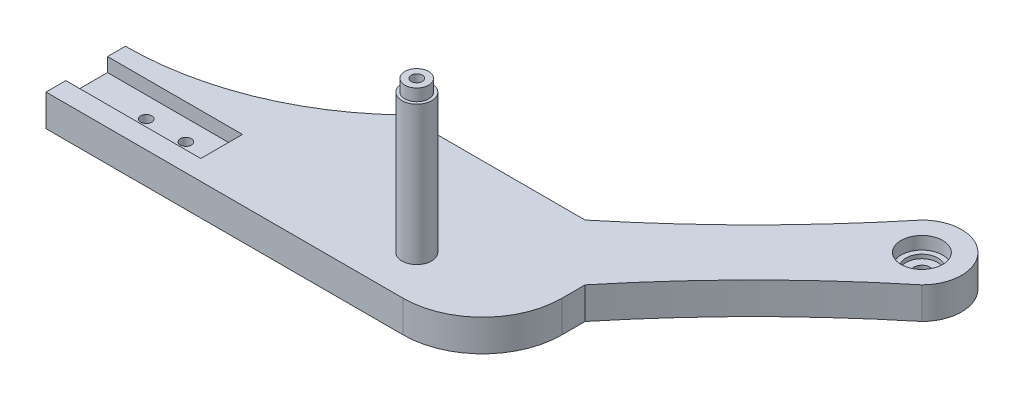
ISO-10303-21;
HEADER;
FILE_DESCRIPTION(('STEP AP214'),'2;1');
FILE_NAME('part.step','',(''),(''),'','','');
FILE_SCHEMA(('AUTOMOTIVE_DESIGN { 1 0 10303 214 1 1 1 1 }'));
ENDSEC;
DATA;
#1=APPLICATION_CONTEXT('core data for automotive mechanical design processes');
#2=APPLICATION_PROTOCOL_DEFINITION('international standard','automotive_design',2000,#1);
#3=PRODUCT_CONTEXT('',#1,'mechanical');
#4=PRODUCT('Part','Part','',(#3));
#5=PRODUCT_RELATED_PRODUCT_CATEGORY('part','',(#4));
#6=PRODUCT_DEFINITION_FORMATION('','',#4);
#7=PRODUCT_DEFINITION_CONTEXT('part definition',#1,'design');
#8=PRODUCT_DEFINITION('design','',#6,#7);
#9=PRODUCT_DEFINITION_SHAPE('','',#8);
#10=(LENGTH_UNIT() NAMED_UNIT(*) SI_UNIT(.MILLI.,.METRE.));
#11=(NAMED_UNIT(*) PLANE_ANGLE_UNIT() SI_UNIT($,.RADIAN.));
#12=(NAMED_UNIT(*) SI_UNIT($,.STERADIAN.) SOLID_ANGLE_UNIT());
#13=UNCERTAINTY_MEASURE_WITH_UNIT(LENGTH_MEASURE(1.E-05),#10,'distance_accuracy_value','');
#14=(GEOMETRIC_REPRESENTATION_CONTEXT(3) GLOBAL_UNCERTAINTY_ASSIGNED_CONTEXT((#13)) GLOBAL_UNIT_ASSIGNED_CONTEXT((#10,
#11,#12)) REPRESENTATION_CONTEXT('',''));
#15=CARTESIAN_POINT('',(0.,0.,0.));
#16=DIRECTION('',(0.,0.,1.));
#17=DIRECTION('',(1.,0.,0.));
#18=AXIS2_PLACEMENT_3D('',#15,#16,#17);
#19=CARTESIAN_POINT('',(90.3553390593273,8.,-55.3553390593275));
#20=DIRECTION('',(0.,1.,0.));
#21=DIRECTION('',(0.,0.,1.));
#22=AXIS2_PLACEMENT_3D('',#19,#20,#21);
#23=PLANE('',#22);
#24=DIRECTION('',(1.,0.,0.));
#25=VECTOR('',#24,1.);
#26=CARTESIAN_POINT('',(-55.,8.,20.));
#27=LINE('',#26,#25);
#28=CARTESIAN_POINT('',(-55.,8.,20.));
#29=VERTEX_POINT('',#28);
#30=CARTESIAN_POINT('',(35.,8.,20.));
#31=VERTEX_POINT('',#30);
#32=EDGE_CURVE('E232',#29,#31,#27,.T.);
#33=ORIENTED_EDGE('',*,*,#32,.T.);
#34=CARTESIAN_POINT('',(35.,8.,0.));
#35=DIRECTION('',(0.,1.,0.));
#36=DIRECTION('',(0.,0.,1.));
#37=AXIS2_PLACEMENT_3D('',#34,#35,#36);
#38=CIRCLE('',#37,20.);
#39=CARTESIAN_POINT('',(55.,8.,0.));
#40=VERTEX_POINT('',#39);
#41=EDGE_CURVE('E11',#31,#40,#38,.T.);
#42=ORIENTED_EDGE('',*,*,#41,.T.);
#43=DIRECTION('',(0.,0.,-1.));
#44=VECTOR('',#43,1.);
#45=CARTESIAN_POINT('',(55.,8.,20.));
#46=LINE('',#45,#44);
#47=CARTESIAN_POINT('',(55.,8.,-5.85786437626911));
#48=VERTEX_POINT('',#47);
#49=EDGE_CURVE('E234',#40,#48,#46,.T.);
#50=ORIENTED_EDGE('',*,*,#49,.T.);
#51=CARTESIAN_POINT('',(287.281912627651,8.,183.997641380188));
#52=DIRECTION('',(0.,-1.,0.));
#53=DIRECTION('',(1.,0.,0.));
#54=AXIS2_PLACEMENT_3D('',#51,#52,#53);
#55=CIRCLE('',#54,300.);
#56=CARTESIAN_POINT('',(97.4264068711927,8.,-48.2842712474621));
#57=VERTEX_POINT('',#56);
#58=EDGE_CURVE('E213',#48,#57,#55,.T.);
#59=ORIENTED_EDGE('',*,*,#58,.T.);
#60=CARTESIAN_POINT('',(90.3553390593273,8.,-55.3553390593275));
#61=DIRECTION('',(0.,1.,0.));
#62=DIRECTION('',(0.,0.,1.));
#63=AXIS2_PLACEMENT_3D('',#60,#61,#62);
#64=CIRCLE('',#63,10.);
#65=CARTESIAN_POINT('',(83.2842712474618,8.,-62.4264068711929));
#66=VERTEX_POINT('',#65);
#67=EDGE_CURVE('E236',#57,#66,#64,.T.);
#68=ORIENTED_EDGE('',*,*,#67,.T.);
#69=CARTESIAN_POINT('',(-148.997641380189,8.,-252.28191262765));
#70=DIRECTION('',(0.,1.,0.));
#71=DIRECTION('',(0.,0.,-1.));
#72=AXIS2_PLACEMENT_3D('',#69,#70,#71);
#73=CIRCLE('',#72,300.);
#74=CARTESIAN_POINT('',(40.857864376269,8.,-20.));
#75=VERTEX_POINT('',#74);
#76=EDGE_CURVE('E218',#75,#66,#73,.T.);
#77=ORIENTED_EDGE('',*,*,#76,.F.);
#78=DIRECTION('',(-1.,0.,0.));
#79=VECTOR('',#78,1.);
#80=CARTESIAN_POINT('',(-55.,8.,-20.));
#81=LINE('',#80,#79);
#82=CARTESIAN_POINT('',(-4.99999999999999,8.,-20.));
#83=VERTEX_POINT('',#82);
#84=EDGE_CURVE('E239',#75,#83,#81,.T.);
#85=ORIENTED_EDGE('',*,*,#84,.T.);
#86=CARTESIAN_POINT('',(-55.,8.,-72.5));
#87=DIRECTION('',(0.,1.,0.));
#88=DIRECTION('',(0.,0.,-1.));
#89=AXIS2_PLACEMENT_3D('',#86,#87,#88);
#90=CIRCLE('',#89,72.5);
#91=CARTESIAN_POINT('',(-55.,8.,0.));
#92=VERTEX_POINT('',#91);
#93=EDGE_CURVE('E171',#92,#83,#90,.T.);
#94=ORIENTED_EDGE('',*,*,#93,.F.);
#95=DIRECTION('',(0.,0.,1.));
#96=VECTOR('',#95,1.);
#97=CARTESIAN_POINT('',(-55.,8.,20.));
#98=LINE('',#97,#96);
#99=CARTESIAN_POINT('',(-55.,8.,4.5));
#100=VERTEX_POINT('',#99);
#101=EDGE_CURVE('E229',#92,#100,#98,.T.);
#102=ORIENTED_EDGE('',*,*,#101,.T.);
#103=DIRECTION('',(-1.,0.,0.));
#104=VECTOR('',#103,1.);
#105=CARTESIAN_POINT('',(-55.,8.,4.5));
#106=LINE('',#105,#104);
#107=CARTESIAN_POINT('',(-21.,8.,4.5));
#108=VERTEX_POINT('',#107);
#109=EDGE_CURVE('E155',#108,#100,#106,.T.);
#110=ORIENTED_EDGE('',*,*,#109,.F.);
#111=DIRECTION('',(0.,0.,-1.));
#112=VECTOR('',#111,1.);
#113=CARTESIAN_POINT('',(-21.,8.,15.));
#114=LINE('',#113,#112);
#115=CARTESIAN_POINT('',(-21.,8.,15.));
#116=VERTEX_POINT('',#115);
#117=EDGE_CURVE('E290',#116,#108,#114,.T.);
#118=ORIENTED_EDGE('',*,*,#117,.F.);
#119=DIRECTION('',(1.,0.,0.));
#120=VECTOR('',#119,1.);
#121=CARTESIAN_POINT('',(-55.,8.,15.));
#122=LINE('',#121,#120);
#123=CARTESIAN_POINT('',(-55.,8.,15.));
#124=VERTEX_POINT('',#123);
#125=EDGE_CURVE('E279',#124,#116,#122,.T.);
#126=ORIENTED_EDGE('',*,*,#125,.F.);
#127=EDGE_CURVE('E160',#124,#29,#98,.T.);
#128=ORIENTED_EDGE('',*,*,#127,.T.);
#129=EDGE_LOOP('',(#33,#42,#50,#59,#68,#77,#85,#94,#102,#110,#118,#126,#128));
#130=FACE_BOUND('',#129,.T.);
#131=CARTESIAN_POINT('',(26.7157287525382,8.,8.28427124746194));
#132=DIRECTION('',(0.,1.,0.));
#133=DIRECTION('',(0.,0.,1.));
#134=AXIS2_PLACEMENT_3D('',#131,#132,#133);
#135=CIRCLE('',#134,3.75);
#136=CARTESIAN_POINT('',(26.7157287525382,8.,12.0342712474619));
#137=VERTEX_POINT('',#136);
#138=EDGE_CURVE('E182',#137,#137,#135,.T.);
#139=ORIENTED_EDGE('',*,*,#138,.F.);
#140=EDGE_LOOP('',(#139));
#141=FACE_BOUND('',#140,.T.);
#142=CARTESIAN_POINT('',(90.3553390593273,8.,-55.3553390593275));
#143=DIRECTION('',(0.,1.,0.));
#144=DIRECTION('',(0.,0.,1.));
#145=AXIS2_PLACEMENT_3D('',#142,#143,#144);
#146=CIRCLE('',#145,5.24999999999999);
#147=CARTESIAN_POINT('',(90.3553390593273,8.,-50.1053390593275));
#148=VERTEX_POINT('',#147);
#149=EDGE_CURVE('E207',#148,#148,#146,.T.);
#150=ORIENTED_EDGE('',*,*,#149,.F.);
#151=EDGE_LOOP('',(#150));
#152=FACE_BOUND('',#151,.T.);
#153=ADVANCED_FACE('F38',(#130,#141,#152),#23,.T.);
#154=CARTESIAN_POINT('',(90.3553390593273,0.,-55.3553390593275));
#155=DIRECTION('',(0.,1.,0.));
#156=DIRECTION('',(0.,0.,1.));
#157=AXIS2_PLACEMENT_3D('',#154,#155,#156);
#158=PLANE('',#157);
#159=CARTESIAN_POINT('',(-40.,0.,9.75));
#160=DIRECTION('',(0.,1.,0.));
#161=DIRECTION('',(0.,0.,1.));
#162=AXIS2_PLACEMENT_3D('',#159,#160,#161);
#163=CIRCLE('',#162,1.4);
#164=CARTESIAN_POINT('',(-40.,0.,11.15));
#165=VERTEX_POINT('',#164);
#166=EDGE_CURVE('E275',#165,#165,#163,.T.);
#167=ORIENTED_EDGE('',*,*,#166,.T.);
#168=EDGE_LOOP('',(#167));
#169=FACE_BOUND('',#168,.T.);
#170=CARTESIAN_POINT('',(-30.,0.,9.75));
#171=DIRECTION('',(0.,1.,0.));
#172=DIRECTION('',(0.,0.,1.));
#173=AXIS2_PLACEMENT_3D('',#170,#171,#172);
#174=CIRCLE('',#173,1.4);
#175=CARTESIAN_POINT('',(-30.,0.,11.15));
#176=VERTEX_POINT('',#175);
#177=EDGE_CURVE('E281',#176,#176,#174,.T.);
#178=ORIENTED_EDGE('',*,*,#177,.T.);
#179=EDGE_LOOP('',(#178));
#180=FACE_BOUND('',#179,.T.);
#181=CARTESIAN_POINT('',(90.3553390593273,0.,-55.3553390593275));
#182=DIRECTION('',(0.,-1.,0.));
#183=DIRECTION('',(0.,0.,-1.));
#184=AXIS2_PLACEMENT_3D('',#181,#182,#183);
#185=CIRCLE('',#184,4.99999999999999);
#186=CARTESIAN_POINT('',(90.3553390593273,0.,-60.3553390593275));
#187=VERTEX_POINT('',#186);
#188=EDGE_CURVE('E197',#187,#187,#185,.T.);
#189=ORIENTED_EDGE('',*,*,#188,.F.);
#190=EDGE_LOOP('',(#189));
#191=FACE_BOUND('',#190,.T.);
#192=CARTESIAN_POINT('',(26.7157287525382,0.,8.28427124746194));
#193=DIRECTION('',(0.,1.,0.));
#194=DIRECTION('',(0.,0.,1.));
#195=AXIS2_PLACEMENT_3D('',#192,#193,#194);
#196=CIRCLE('',#195,1.4);
#197=CARTESIAN_POINT('',(26.7157287525382,0.,9.68427124746194));
#198=VERTEX_POINT('',#197);
#199=EDGE_CURVE('E224',#198,#198,#196,.T.);
#200=ORIENTED_EDGE('',*,*,#199,.T.);
#201=EDGE_LOOP('',(#200));
#202=FACE_BOUND('',#201,.T.);
#203=DIRECTION('',(0.,0.,-1.));
#204=VECTOR('',#203,1.);
#205=CARTESIAN_POINT('',(55.,0.,20.));
#206=LINE('',#205,#204);
#207=CARTESIAN_POINT('',(55.,0.,0.));
#208=VERTEX_POINT('',#207);
#209=CARTESIAN_POINT('',(55.,0.,-5.85786437626909));
#210=VERTEX_POINT('',#209);
#211=EDGE_CURVE('E246',#208,#210,#206,.T.);
#212=ORIENTED_EDGE('',*,*,#211,.F.);
#213=CARTESIAN_POINT('',(35.,0.,0.));
#214=DIRECTION('',(0.,1.,0.));
#215=DIRECTION('',(0.,0.,1.));
#216=AXIS2_PLACEMENT_3D('',#213,#214,#215);
#217=CIRCLE('',#216,20.);
#218=CARTESIAN_POINT('',(35.,0.,20.));
#219=VERTEX_POINT('',#218);
#220=EDGE_CURVE('E62',#208,#219,#217,.F.);
#221=ORIENTED_EDGE('',*,*,#220,.T.);
#222=DIRECTION('',(1.,0.,0.));
#223=VECTOR('',#222,1.);
#224=CARTESIAN_POINT('',(-55.,0.,20.));
#225=LINE('',#224,#223);
#226=CARTESIAN_POINT('',(-55.,0.,20.));
#227=VERTEX_POINT('',#226);
#228=EDGE_CURVE('E244',#227,#219,#225,.T.);
#229=ORIENTED_EDGE('',*,*,#228,.F.);
#230=DIRECTION('',(0.,0.,1.));
#231=VECTOR('',#230,1.);
#232=CARTESIAN_POINT('',(-55.,0.,20.));
#233=LINE('',#232,#231);
#234=CARTESIAN_POINT('',(-55.,0.,0.));
#235=VERTEX_POINT('',#234);
#236=EDGE_CURVE('E228',#235,#227,#233,.T.);
#237=ORIENTED_EDGE('',*,*,#236,.F.);
#238=CARTESIAN_POINT('',(-55.,0.,-72.5));
#239=DIRECTION('',(0.,1.,0.));
#240=DIRECTION('',(0.,0.,-1.));
#241=AXIS2_PLACEMENT_3D('',#238,#239,#240);
#242=CIRCLE('',#241,72.5);
#243=CARTESIAN_POINT('',(-4.99999999999999,0.,-20.));
#244=VERTEX_POINT('',#243);
#245=EDGE_CURVE('E167',#235,#244,#242,.T.);
#246=ORIENTED_EDGE('',*,*,#245,.T.);
#247=DIRECTION('',(-1.,0.,0.));
#248=VECTOR('',#247,1.);
#249=CARTESIAN_POINT('',(-55.,0.,-20.));
#250=LINE('',#249,#248);
#251=CARTESIAN_POINT('',(40.857864376269,0.,-20.));
#252=VERTEX_POINT('',#251);
#253=EDGE_CURVE('E251',#252,#244,#250,.T.);
#254=ORIENTED_EDGE('',*,*,#253,.F.);
#255=CARTESIAN_POINT('',(-148.997641380189,0.,-252.28191262765));
#256=DIRECTION('',(0.,1.,0.));
#257=DIRECTION('',(0.,0.,-1.));
#258=AXIS2_PLACEMENT_3D('',#255,#256,#257);
#259=CIRCLE('',#258,300.);
#260=CARTESIAN_POINT('',(83.2842712474618,0.,-62.4264068711929));
#261=VERTEX_POINT('',#260);
#262=EDGE_CURVE('E221',#252,#261,#259,.T.);
#263=ORIENTED_EDGE('',*,*,#262,.T.);
#264=CARTESIAN_POINT('',(90.3553390593273,0.,-55.3553390593275));
#265=DIRECTION('',(0.,1.,0.));
#266=DIRECTION('',(0.,0.,1.));
#267=AXIS2_PLACEMENT_3D('',#264,#265,#266);
#268=CIRCLE('',#267,10.);
#269=CARTESIAN_POINT('',(97.4264068711927,0.,-48.2842712474621));
#270=VERTEX_POINT('',#269);
#271=EDGE_CURVE('E248',#270,#261,#268,.T.);
#272=ORIENTED_EDGE('',*,*,#271,.F.);
#273=CARTESIAN_POINT('',(287.281912627651,0.,183.997641380188));
#274=DIRECTION('',(0.,-1.,0.));
#275=DIRECTION('',(1.,0.,0.));
#276=AXIS2_PLACEMENT_3D('',#273,#274,#275);
#277=CIRCLE('',#276,300.);
#278=EDGE_CURVE('E216',#210,#270,#277,.T.);
#279=ORIENTED_EDGE('',*,*,#278,.F.);
#280=EDGE_LOOP('',(#212,#221,#229,#237,#246,#254,#263,#272,#279));
#281=FACE_BOUND('',#280,.T.);
#282=ADVANCED_FACE('F307',(#169,#180,#191,#202,#281),#158,.F.);
#283=CARTESIAN_POINT('',(-55.,8.,20.));
#284=DIRECTION('',(1.,0.,0.));
#285=DIRECTION('',(0.,0.,-1.));
#286=AXIS2_PLACEMENT_3D('',#283,#284,#285);
#287=PLANE('',#286);
#288=DIRECTION('',(0.,0.,1.));
#289=VECTOR('',#288,1.);
#290=CARTESIAN_POINT('',(-55.,4.5,15.));
#291=LINE('',#290,#289);
#292=CARTESIAN_POINT('',(-55.,4.5,4.5));
#293=VERTEX_POINT('',#292);
#294=CARTESIAN_POINT('',(-55.,4.5,15.));
#295=VERTEX_POINT('',#294);
#296=EDGE_CURVE('E146',#293,#295,#291,.T.);
#297=ORIENTED_EDGE('',*,*,#296,.F.);
#298=DIRECTION('',(0.,1.,0.));
#299=VECTOR('',#298,1.);
#300=CARTESIAN_POINT('',(-55.,4.5,4.5));
#301=LINE('',#300,#299);
#302=EDGE_CURVE('E173',#293,#100,#301,.T.);
#303=ORIENTED_EDGE('',*,*,#302,.T.);
#304=ORIENTED_EDGE('',*,*,#101,.F.);
#305=DIRECTION('',(0.,1.,0.));
#306=VECTOR('',#305,1.);
#307=CARTESIAN_POINT('',(-55.,0.,0.));
#308=LINE('',#307,#306);
#309=EDGE_CURVE('E174',#235,#92,#308,.T.);
#310=ORIENTED_EDGE('',*,*,#309,.F.);
#311=ORIENTED_EDGE('',*,*,#236,.T.);
#312=DIRECTION('',(0.,-1.,0.));
#313=VECTOR('',#312,1.);
#314=CARTESIAN_POINT('',(-55.,8.,20.));
#315=LINE('',#314,#313);
#316=EDGE_CURVE('E187',#29,#227,#315,.T.);
#317=ORIENTED_EDGE('',*,*,#316,.F.);
#318=ORIENTED_EDGE('',*,*,#127,.F.);
#319=DIRECTION('',(0.,1.,0.));
#320=VECTOR('',#319,1.);
#321=CARTESIAN_POINT('',(-55.,4.5,15.));
#322=LINE('',#321,#320);
#323=EDGE_CURVE('E139',#295,#124,#322,.T.);
#324=ORIENTED_EDGE('',*,*,#323,.F.);
#325=EDGE_LOOP('',(#297,#303,#304,#310,#311,#317,#318,#324));
#326=FACE_BOUND('',#325,.T.);
#327=ADVANCED_FACE('F158',(#326),#287,.F.);
#328=CARTESIAN_POINT('',(-55.,8.,20.));
#329=DIRECTION('',(0.,0.,-1.));
#330=DIRECTION('',(-1.,0.,0.));
#331=AXIS2_PLACEMENT_3D('',#328,#329,#330);
#332=PLANE('',#331);
#333=ORIENTED_EDGE('',*,*,#228,.T.);
#334=DIRECTION('',(0.,-1.,0.));
#335=VECTOR('',#334,1.);
#336=CARTESIAN_POINT('',(35.,8.,20.));
#337=LINE('',#336,#335);
#338=EDGE_CURVE('E47',#219,#31,#337,.F.);
#339=ORIENTED_EDGE('',*,*,#338,.T.);
#340=ORIENTED_EDGE('',*,*,#32,.F.);
#341=ORIENTED_EDGE('',*,*,#316,.T.);
#342=EDGE_LOOP('',(#333,#339,#340,#341));
#343=FACE_BOUND('',#342,.T.);
#344=ADVANCED_FACE('F309',(#343),#332,.F.);
#345=CARTESIAN_POINT('',(55.,8.,20.));
#346=DIRECTION('',(-1.,0.,0.));
#347=DIRECTION('',(0.,0.,1.));
#348=AXIS2_PLACEMENT_3D('',#345,#346,#347);
#349=PLANE('',#348);
#350=ORIENTED_EDGE('',*,*,#49,.F.);
#351=DIRECTION('',(0.,-1.,0.));
#352=VECTOR('',#351,1.);
#353=CARTESIAN_POINT('',(55.,8.,0.));
#354=LINE('',#353,#352);
#355=EDGE_CURVE('E186',#40,#208,#354,.T.);
#356=ORIENTED_EDGE('',*,*,#355,.T.);
#357=ORIENTED_EDGE('',*,*,#211,.T.);
#358=DIRECTION('',(0.,-1.,0.));
#359=VECTOR('',#358,1.);
#360=CARTESIAN_POINT('',(55.,8.,-5.85786437626909));
#361=LINE('',#360,#359);
#362=EDGE_CURVE('E261',#48,#210,#361,.T.);
#363=ORIENTED_EDGE('',*,*,#362,.F.);
#364=EDGE_LOOP('',(#350,#356,#357,#363));
#365=FACE_BOUND('',#364,.T.);
#366=ADVANCED_FACE('F315',(#365),#349,.F.);
#367=CARTESIAN_POINT('',(90.3553390593273,8.,-55.3553390593275));
#368=DIRECTION('',(0.,-1.,0.));
#369=DIRECTION('',(0.,0.,-1.));
#370=AXIS2_PLACEMENT_3D('',#367,#368,#369);
#371=CYLINDRICAL_SURFACE('',#370,10.);
#372=ORIENTED_EDGE('',*,*,#271,.T.);
#373=DIRECTION('',(0.,-1.,0.));
#374=VECTOR('',#373,1.);
#375=CARTESIAN_POINT('',(83.2842712474618,8.,-62.4264068711929));
#376=LINE('',#375,#374);
#377=EDGE_CURVE('E256',#66,#261,#376,.T.);
#378=ORIENTED_EDGE('',*,*,#377,.F.);
#379=ORIENTED_EDGE('',*,*,#67,.F.);
#380=DIRECTION('',(0.,-1.,0.));
#381=VECTOR('',#380,1.);
#382=CARTESIAN_POINT('',(97.4264068711928,8.,-48.284271247462));
#383=LINE('',#382,#381);
#384=EDGE_CURVE('E258',#57,#270,#383,.T.);
#385=ORIENTED_EDGE('',*,*,#384,.T.);
#386=EDGE_LOOP('',(#372,#378,#379,#385));
#387=FACE_BOUND('',#386,.T.);
#388=ADVANCED_FACE('F324',(#387),#371,.T.);
#389=CARTESIAN_POINT('',(-55.,8.,-20.));
#390=DIRECTION('',(0.,0.,1.));
#391=DIRECTION('',(1.,0.,0.));
#392=AXIS2_PLACEMENT_3D('',#389,#390,#391);
#393=PLANE('',#392);
#394=ORIENTED_EDGE('',*,*,#253,.T.);
#395=DIRECTION('',(0.,1.,0.));
#396=VECTOR('',#395,1.);
#397=CARTESIAN_POINT('',(-4.99999999999999,0.,-20.));
#398=LINE('',#397,#396);
#399=EDGE_CURVE('E170',#244,#83,#398,.T.);
#400=ORIENTED_EDGE('',*,*,#399,.T.);
#401=ORIENTED_EDGE('',*,*,#84,.F.);
#402=DIRECTION('',(0.,-1.,0.));
#403=VECTOR('',#402,1.);
#404=CARTESIAN_POINT('',(40.857864376269,8.,-20.));
#405=LINE('',#404,#403);
#406=EDGE_CURVE('E242',#75,#252,#405,.T.);
#407=ORIENTED_EDGE('',*,*,#406,.T.);
#408=EDGE_LOOP('',(#394,#400,#401,#407));
#409=FACE_BOUND('',#408,.T.);
#410=ADVANCED_FACE('F330',(#409),#393,.F.);
#411=CARTESIAN_POINT('',(26.7157287525382,0.,8.28427124746194));
#412=DIRECTION('',(0.,1.,0.));
#413=DIRECTION('',(0.,0.,1.));
#414=AXIS2_PLACEMENT_3D('',#411,#412,#413);
#415=CYLINDRICAL_SURFACE('',#414,1.4);
#416=ORIENTED_EDGE('',*,*,#199,.F.);
#417=EDGE_LOOP('',(#416));
#418=FACE_BOUND('',#417,.T.);
#419=CARTESIAN_POINT('',(26.7157287525382,46.,8.28427124746194));
#420=DIRECTION('',(0.,1.,0.));
#421=DIRECTION('',(0.,0.,1.));
#422=AXIS2_PLACEMENT_3D('',#419,#420,#421);
#423=CIRCLE('',#422,1.4);
#424=CARTESIAN_POINT('',(26.7157287525382,46.,9.68427124746194));
#425=VERTEX_POINT('',#424);
#426=EDGE_CURVE('E176',#425,#425,#423,.T.);
#427=ORIENTED_EDGE('',*,*,#426,.T.);
#428=EDGE_LOOP('',(#427));
#429=FACE_BOUND('',#428,.T.);
#430=ADVANCED_FACE('F353',(#418,#429),#415,.F.);
#431=CARTESIAN_POINT('',(-148.997641380189,0.,-252.28191262765));
#432=DIRECTION('',(0.,1.,0.));
#433=DIRECTION('',(0.,0.,1.));
#434=AXIS2_PLACEMENT_3D('',#431,#432,#433);
#435=CYLINDRICAL_SURFACE('',#434,300.);
#436=ORIENTED_EDGE('',*,*,#76,.T.);
#437=ORIENTED_EDGE('',*,*,#377,.T.);
#438=ORIENTED_EDGE('',*,*,#262,.F.);
#439=ORIENTED_EDGE('',*,*,#406,.F.);
#440=EDGE_LOOP('',(#436,#437,#438,#439));
#441=FACE_BOUND('',#440,.T.);
#442=ADVANCED_FACE('F439',(#441),#435,.F.);
#443=CARTESIAN_POINT('',(287.281912627651,0.,183.997641380188));
#444=DIRECTION('',(0.,1.,0.));
#445=DIRECTION('',(0.,0.,1.));
#446=AXIS2_PLACEMENT_3D('',#443,#444,#445);
#447=CYLINDRICAL_SURFACE('',#446,300.);
#448=ORIENTED_EDGE('',*,*,#58,.F.);
#449=ORIENTED_EDGE('',*,*,#362,.T.);
#450=ORIENTED_EDGE('',*,*,#278,.T.);
#451=ORIENTED_EDGE('',*,*,#384,.F.);
#452=EDGE_LOOP('',(#448,#449,#450,#451));
#453=FACE_BOUND('',#452,.T.);
#454=ADVANCED_FACE('F321',(#453),#447,.F.);
#455=CARTESIAN_POINT('',(90.3553390593273,4.8,-55.3553390593275));
#456=DIRECTION('',(0.,1.,0.));
#457=DIRECTION('',(0.,0.,1.));
#458=AXIS2_PLACEMENT_3D('',#455,#456,#457);
#459=PLANE('',#458);
#460=CARTESIAN_POINT('',(90.3553390593273,4.8,-55.3553390593275));
#461=DIRECTION('',(0.,1.,0.));
#462=DIRECTION('',(0.,0.,1.));
#463=AXIS2_PLACEMENT_3D('',#460,#461,#462);
#464=CIRCLE('',#463,4.00000000000001);
#465=CARTESIAN_POINT('',(90.3553390593273,4.8,-51.3553390593275));
#466=VERTEX_POINT('',#465);
#467=EDGE_CURVE('E201',#466,#466,#464,.T.);
#468=ORIENTED_EDGE('',*,*,#467,.F.);
#469=EDGE_LOOP('',(#468));
#470=FACE_BOUND('',#469,.T.);
#471=CARTESIAN_POINT('',(90.3553390593273,4.8,-55.3553390593275));
#472=DIRECTION('',(0.,1.,0.));
#473=DIRECTION('',(0.,0.,1.));
#474=AXIS2_PLACEMENT_3D('',#471,#472,#473);
#475=CIRCLE('',#474,5.24999999999999);
#476=CARTESIAN_POINT('',(90.3553390593273,4.8,-50.1053390593275));
#477=VERTEX_POINT('',#476);
#478=EDGE_CURVE('E210',#477,#477,#475,.T.);
#479=ORIENTED_EDGE('',*,*,#478,.T.);
#480=EDGE_LOOP('',(#479));
#481=FACE_BOUND('',#480,.T.);
#482=ADVANCED_FACE('F467',(#470,#481),#459,.T.);
#483=CARTESIAN_POINT('',(90.3553390593273,4.8,-55.3553390593275));
#484=DIRECTION('',(0.,1.,0.));
#485=DIRECTION('',(0.,0.,1.));
#486=AXIS2_PLACEMENT_3D('',#483,#484,#485);
#487=CYLINDRICAL_SURFACE('',#486,5.24999999999999);
#488=ORIENTED_EDGE('',*,*,#478,.F.);
#489=EDGE_LOOP('',(#488));
#490=FACE_BOUND('',#489,.T.);
#491=ORIENTED_EDGE('',*,*,#149,.T.);
#492=EDGE_LOOP('',(#491));
#493=FACE_BOUND('',#492,.T.);
#494=ADVANCED_FACE('F464',(#490,#493),#487,.F.);
#495=CARTESIAN_POINT('',(90.3553390593273,3.8,-55.3553390593275));
#496=DIRECTION('',(0.,1.,0.));
#497=DIRECTION('',(0.,0.,1.));
#498=AXIS2_PLACEMENT_3D('',#495,#496,#497);
#499=PLANE('',#498);
#500=CARTESIAN_POINT('',(90.3553390593273,3.8,-55.3553390593275));
#501=DIRECTION('',(0.,1.,0.));
#502=DIRECTION('',(0.,0.,1.));
#503=AXIS2_PLACEMENT_3D('',#500,#501,#502);
#504=CIRCLE('',#503,2.);
#505=CARTESIAN_POINT('',(90.3553390593273,3.8,-53.3553390593275));
#506=VERTEX_POINT('',#505);
#507=EDGE_CURVE('E194',#506,#506,#504,.T.);
#508=ORIENTED_EDGE('',*,*,#507,.F.);
#509=EDGE_LOOP('',(#508));
#510=FACE_BOUND('',#509,.T.);
#511=CARTESIAN_POINT('',(90.3553390593273,3.8,-55.3553390593275));
#512=DIRECTION('',(0.,1.,0.));
#513=DIRECTION('',(0.,0.,1.));
#514=AXIS2_PLACEMENT_3D('',#511,#512,#513);
#515=CIRCLE('',#514,4.00000000000001);
#516=CARTESIAN_POINT('',(90.3553390593273,3.8,-51.3553390593275));
#517=VERTEX_POINT('',#516);
#518=EDGE_CURVE('E204',#517,#517,#515,.T.);
#519=ORIENTED_EDGE('',*,*,#518,.T.);
#520=EDGE_LOOP('',(#519));
#521=FACE_BOUND('',#520,.T.);
#522=ADVANCED_FACE('F466',(#510,#521),#499,.T.);
#523=CARTESIAN_POINT('',(90.3553390593273,3.8,-55.3553390593275));
#524=DIRECTION('',(0.,1.,0.));
#525=DIRECTION('',(0.,0.,1.));
#526=AXIS2_PLACEMENT_3D('',#523,#524,#525);
#527=CYLINDRICAL_SURFACE('',#526,4.00000000000001);
#528=ORIENTED_EDGE('',*,*,#518,.F.);
#529=EDGE_LOOP('',(#528));
#530=FACE_BOUND('',#529,.T.);
#531=ORIENTED_EDGE('',*,*,#467,.T.);
#532=EDGE_LOOP('',(#531));
#533=FACE_BOUND('',#532,.T.);
#534=ADVANCED_FACE('F474',(#530,#533),#527,.F.);
#535=CARTESIAN_POINT('',(90.3553390593273,2.,-55.3553390593275));
#536=DIRECTION('',(0.,-1.,0.));
#537=DIRECTION('',(0.,0.,-1.));
#538=AXIS2_PLACEMENT_3D('',#535,#536,#537);
#539=PLANE('',#538);
#540=CARTESIAN_POINT('',(90.3553390593273,2.,-55.3553390593275));
#541=DIRECTION('',(0.,-1.,0.));
#542=DIRECTION('',(0.,0.,-1.));
#543=AXIS2_PLACEMENT_3D('',#540,#541,#542);
#544=CIRCLE('',#543,2.);
#545=CARTESIAN_POINT('',(90.3553390593273,2.,-57.3553390593275));
#546=VERTEX_POINT('',#545);
#547=EDGE_CURVE('E191',#546,#546,#544,.T.);
#548=ORIENTED_EDGE('',*,*,#547,.F.);
#549=EDGE_LOOP('',(#548));
#550=FACE_BOUND('',#549,.T.);
#551=CARTESIAN_POINT('',(90.3553390593273,2.,-55.3553390593275));
#552=DIRECTION('',(0.,-1.,0.));
#553=DIRECTION('',(0.,0.,-1.));
#554=AXIS2_PLACEMENT_3D('',#551,#552,#553);
#555=CIRCLE('',#554,4.99999999999999);
#556=CARTESIAN_POINT('',(90.3553390593273,2.,-60.3553390593275));
#557=VERTEX_POINT('',#556);
#558=EDGE_CURVE('E198',#557,#557,#555,.T.);
#559=ORIENTED_EDGE('',*,*,#558,.T.);
#560=EDGE_LOOP('',(#559));
#561=FACE_BOUND('',#560,.T.);
#562=ADVANCED_FACE('F509',(#550,#561),#539,.T.);
#563=CARTESIAN_POINT('',(90.3553390593273,2.,-55.3553390593275));
#564=DIRECTION('',(0.,-1.,0.));
#565=DIRECTION('',(0.,0.,-1.));
#566=AXIS2_PLACEMENT_3D('',#563,#564,#565);
#567=CYLINDRICAL_SURFACE('',#566,4.99999999999999);
#568=ORIENTED_EDGE('',*,*,#558,.F.);
#569=EDGE_LOOP('',(#568));
#570=FACE_BOUND('',#569,.T.);
#571=ORIENTED_EDGE('',*,*,#188,.T.);
#572=EDGE_LOOP('',(#571));
#573=FACE_BOUND('',#572,.T.);
#574=ADVANCED_FACE('F517',(#570,#573),#567,.F.);
#575=CARTESIAN_POINT('',(90.3553390593273,0.,-55.3553390593275));
#576=DIRECTION('',(0.,1.,0.));
#577=DIRECTION('',(0.,0.,1.));
#578=AXIS2_PLACEMENT_3D('',#575,#576,#577);
#579=CYLINDRICAL_SURFACE('',#578,2.);
#580=ORIENTED_EDGE('',*,*,#507,.T.);
#581=EDGE_LOOP('',(#580));
#582=FACE_BOUND('',#581,.T.);
#583=ORIENTED_EDGE('',*,*,#547,.T.);
#584=EDGE_LOOP('',(#583));
#585=FACE_BOUND('',#584,.T.);
#586=ADVANCED_FACE('F458',(#582,#585),#579,.F.);
#587=CARTESIAN_POINT('',(26.7157287525382,43.,8.28427124746194));
#588=DIRECTION('',(0.,-1.,0.));
#589=DIRECTION('',(0.,0.,-1.));
#590=AXIS2_PLACEMENT_3D('',#587,#588,#589);
#591=CYLINDRICAL_SURFACE('',#590,3.75);
#592=CARTESIAN_POINT('',(26.7157287525382,43.,8.28427124746194));
#593=DIRECTION('',(0.,1.,0.));
#594=DIRECTION('',(0.,0.,1.));
#595=AXIS2_PLACEMENT_3D('',#592,#593,#594);
#596=CIRCLE('',#595,3.75);
#597=CARTESIAN_POINT('',(26.7157287525382,43.,12.0342712474619));
#598=VERTEX_POINT('',#597);
#599=EDGE_CURVE('E188',#598,#598,#596,.T.);
#600=ORIENTED_EDGE('',*,*,#599,.F.);
#601=EDGE_LOOP('',(#600));
#602=FACE_BOUND('',#601,.T.);
#603=ORIENTED_EDGE('',*,*,#138,.T.);
#604=EDGE_LOOP('',(#603));
#605=FACE_BOUND('',#604,.T.);
#606=ADVANCED_FACE('F452',(#602,#605),#591,.T.);
#607=CARTESIAN_POINT('',(26.7157287525382,43.,8.28427124746194));
#608=DIRECTION('',(0.,1.,0.));
#609=DIRECTION('',(0.,0.,1.));
#610=AXIS2_PLACEMENT_3D('',#607,#608,#609);
#611=PLANE('',#610);
#612=CARTESIAN_POINT('',(26.7157287525382,43.,8.28427124746194));
#613=DIRECTION('',(0.,1.,0.));
#614=DIRECTION('',(0.,0.,1.));
#615=AXIS2_PLACEMENT_3D('',#612,#613,#614);
#616=CIRCLE('',#615,3.);
#617=CARTESIAN_POINT('',(26.7157287525382,43.,11.2842712474619));
#618=VERTEX_POINT('',#617);
#619=EDGE_CURVE('E183',#618,#618,#616,.T.);
#620=ORIENTED_EDGE('',*,*,#619,.F.);
#621=EDGE_LOOP('',(#620));
#622=FACE_BOUND('',#621,.T.);
#623=ORIENTED_EDGE('',*,*,#599,.T.);
#624=EDGE_LOOP('',(#623));
#625=FACE_BOUND('',#624,.T.);
#626=ADVANCED_FACE('F446',(#622,#625),#611,.T.);
#627=CARTESIAN_POINT('',(26.7157287525382,46.,8.28427124746194));
#628=DIRECTION('',(0.,-1.,0.));
#629=DIRECTION('',(0.,0.,-1.));
#630=AXIS2_PLACEMENT_3D('',#627,#628,#629);
#631=CYLINDRICAL_SURFACE('',#630,3.);
#632=CARTESIAN_POINT('',(26.7157287525382,46.,8.28427124746194));
#633=DIRECTION('',(0.,1.,0.));
#634=DIRECTION('',(0.,0.,1.));
#635=AXIS2_PLACEMENT_3D('',#632,#633,#634);
#636=CIRCLE('',#635,3.);
#637=CARTESIAN_POINT('',(26.7157287525382,46.,11.2842712474619));
#638=VERTEX_POINT('',#637);
#639=EDGE_CURVE('E179',#638,#638,#636,.T.);
#640=ORIENTED_EDGE('',*,*,#639,.F.);
#641=EDGE_LOOP('',(#640));
#642=FACE_BOUND('',#641,.T.);
#643=ORIENTED_EDGE('',*,*,#619,.T.);
#644=EDGE_LOOP('',(#643));
#645=FACE_BOUND('',#644,.T.);
#646=ADVANCED_FACE('F340',(#642,#645),#631,.T.);
#647=CARTESIAN_POINT('',(26.7157287525382,46.,8.28427124746194));
#648=DIRECTION('',(0.,1.,0.));
#649=DIRECTION('',(0.,0.,1.));
#650=AXIS2_PLACEMENT_3D('',#647,#648,#649);
#651=PLANE('',#650);
#652=ORIENTED_EDGE('',*,*,#426,.F.);
#653=EDGE_LOOP('',(#652));
#654=FACE_BOUND('',#653,.T.);
#655=ORIENTED_EDGE('',*,*,#639,.T.);
#656=EDGE_LOOP('',(#655));
#657=FACE_BOUND('',#656,.T.);
#658=ADVANCED_FACE('F333',(#654,#657),#651,.T.);
#659=CARTESIAN_POINT('',(-55.,0.,-72.5));
#660=DIRECTION('',(0.,1.,0.));
#661=DIRECTION('',(0.,0.,1.));
#662=AXIS2_PLACEMENT_3D('',#659,#660,#661);
#663=CYLINDRICAL_SURFACE('',#662,72.5);
#664=ORIENTED_EDGE('',*,*,#93,.T.);
#665=ORIENTED_EDGE('',*,*,#399,.F.);
#666=ORIENTED_EDGE('',*,*,#245,.F.);
#667=ORIENTED_EDGE('',*,*,#309,.T.);
#668=EDGE_LOOP('',(#664,#665,#666,#667));
#669=FACE_BOUND('',#668,.T.);
#670=ADVANCED_FACE('F331',(#669),#663,.F.);
#671=CARTESIAN_POINT('',(-55.,4.5,4.5));
#672=DIRECTION('',(0.,0.,-1.));
#673=DIRECTION('',(-1.,0.,0.));
#674=AXIS2_PLACEMENT_3D('',#671,#672,#673);
#675=PLANE('',#674);
#676=ORIENTED_EDGE('',*,*,#109,.T.);
#677=ORIENTED_EDGE('',*,*,#302,.F.);
#678=DIRECTION('',(-1.,0.,0.));
#679=VECTOR('',#678,1.);
#680=CARTESIAN_POINT('',(-55.,4.5,4.5));
#681=LINE('',#680,#679);
#682=CARTESIAN_POINT('',(-21.,4.5,4.5));
#683=VERTEX_POINT('',#682);
#684=EDGE_CURVE('E151',#683,#293,#681,.T.);
#685=ORIENTED_EDGE('',*,*,#684,.F.);
#686=DIRECTION('',(0.,1.,0.));
#687=VECTOR('',#686,1.);
#688=CARTESIAN_POINT('',(-21.,4.5,4.5));
#689=LINE('',#688,#687);
#690=EDGE_CURVE('E162',#683,#108,#689,.T.);
#691=ORIENTED_EDGE('',*,*,#690,.T.);
#692=EDGE_LOOP('',(#676,#677,#685,#691));
#693=FACE_BOUND('',#692,.T.);
#694=ADVANCED_FACE('F295',(#693),#675,.F.);
#695=CARTESIAN_POINT('',(-21.,4.5,15.));
#696=DIRECTION('',(1.,0.,0.));
#697=DIRECTION('',(0.,0.,-1.));
#698=AXIS2_PLACEMENT_3D('',#695,#696,#697);
#699=PLANE('',#698);
#700=ORIENTED_EDGE('',*,*,#117,.T.);
#701=ORIENTED_EDGE('',*,*,#690,.F.);
#702=DIRECTION('',(0.,0.,-1.));
#703=VECTOR('',#702,1.);
#704=CARTESIAN_POINT('',(-21.,4.5,15.));
#705=LINE('',#704,#703);
#706=CARTESIAN_POINT('',(-21.,4.5,15.));
#707=VERTEX_POINT('',#706);
#708=EDGE_CURVE('E145',#707,#683,#705,.T.);
#709=ORIENTED_EDGE('',*,*,#708,.F.);
#710=DIRECTION('',(0.,1.,0.));
#711=VECTOR('',#710,1.);
#712=CARTESIAN_POINT('',(-21.,4.5,15.));
#713=LINE('',#712,#711);
#714=EDGE_CURVE('E141',#707,#116,#713,.T.);
#715=ORIENTED_EDGE('',*,*,#714,.T.);
#716=EDGE_LOOP('',(#700,#701,#709,#715));
#717=FACE_BOUND('',#716,.T.);
#718=ADVANCED_FACE('F299',(#717),#699,.F.);
#719=CARTESIAN_POINT('',(-55.,4.5,15.));
#720=DIRECTION('',(0.,0.,1.));
#721=DIRECTION('',(1.,0.,0.));
#722=AXIS2_PLACEMENT_3D('',#719,#720,#721);
#723=PLANE('',#722);
#724=ORIENTED_EDGE('',*,*,#125,.T.);
#725=ORIENTED_EDGE('',*,*,#714,.F.);
#726=DIRECTION('',(1.,0.,0.));
#727=VECTOR('',#726,1.);
#728=CARTESIAN_POINT('',(-55.,4.5,15.));
#729=LINE('',#728,#727);
#730=EDGE_CURVE('E134',#295,#707,#729,.T.);
#731=ORIENTED_EDGE('',*,*,#730,.F.);
#732=ORIENTED_EDGE('',*,*,#323,.T.);
#733=EDGE_LOOP('',(#724,#725,#731,#732));
#734=FACE_BOUND('',#733,.T.);
#735=ADVANCED_FACE('F137',(#734),#723,.F.);
#736=CARTESIAN_POINT('',(0.,4.5,0.));
#737=DIRECTION('',(0.,-1.,0.));
#738=DIRECTION('',(0.,0.,-1.));
#739=AXIS2_PLACEMENT_3D('',#736,#737,#738);
#740=PLANE('',#739);
#741=CARTESIAN_POINT('',(-40.,4.5,9.75));
#742=DIRECTION('',(0.,-1.,0.));
#743=DIRECTION('',(0.,0.,-1.));
#744=AXIS2_PLACEMENT_3D('',#741,#742,#743);
#745=CIRCLE('',#744,1.4);
#746=CARTESIAN_POINT('',(-40.,4.5,8.35000000000001));
#747=VERTEX_POINT('',#746);
#748=EDGE_CURVE('E42',#747,#747,#745,.T.);
#749=ORIENTED_EDGE('',*,*,#748,.T.);
#750=EDGE_LOOP('',(#749));
#751=FACE_BOUND('',#750,.T.);
#752=CARTESIAN_POINT('',(-30.,4.5,9.75));
#753=DIRECTION('',(0.,-1.,0.));
#754=DIRECTION('',(0.,0.,-1.));
#755=AXIS2_PLACEMENT_3D('',#752,#753,#754);
#756=CIRCLE('',#755,1.4);
#757=CARTESIAN_POINT('',(-30.,4.5,8.35));
#758=VERTEX_POINT('',#757);
#759=EDGE_CURVE('E273',#758,#758,#756,.T.);
#760=ORIENTED_EDGE('',*,*,#759,.T.);
#761=EDGE_LOOP('',(#760));
#762=FACE_BOUND('',#761,.T.);
#763=ORIENTED_EDGE('',*,*,#296,.T.);
#764=ORIENTED_EDGE('',*,*,#730,.T.);
#765=ORIENTED_EDGE('',*,*,#708,.T.);
#766=ORIENTED_EDGE('',*,*,#684,.T.);
#767=EDGE_LOOP('',(#763,#764,#765,#766));
#768=FACE_BOUND('',#767,.T.);
#769=ADVANCED_FACE('F149',(#751,#762,#768),#740,.F.);
#770=CARTESIAN_POINT('',(35.,8.,0.));
#771=DIRECTION('',(0.,-1.,0.));
#772=DIRECTION('',(0.,0.,-1.));
#773=AXIS2_PLACEMENT_3D('',#770,#771,#772);
#774=CYLINDRICAL_SURFACE('',#773,20.);
#775=ORIENTED_EDGE('',*,*,#41,.F.);
#776=ORIENTED_EDGE('',*,*,#338,.F.);
#777=ORIENTED_EDGE('',*,*,#220,.F.);
#778=ORIENTED_EDGE('',*,*,#355,.F.);
#779=EDGE_LOOP('',(#775,#776,#777,#778));
#780=FACE_BOUND('',#779,.T.);
#781=ADVANCED_FACE('F40',(#780),#774,.T.);
#782=CARTESIAN_POINT('',(-30.,0.,9.75));
#783=DIRECTION('',(0.,1.,0.));
#784=DIRECTION('',(0.,0.,1.));
#785=AXIS2_PLACEMENT_3D('',#782,#783,#784);
#786=CYLINDRICAL_SURFACE('',#785,1.4);
#787=ORIENTED_EDGE('',*,*,#177,.F.);
#788=EDGE_LOOP('',(#787));
#789=FACE_BOUND('',#788,.T.);
#790=ORIENTED_EDGE('',*,*,#759,.F.);
#791=EDGE_LOOP('',(#790));
#792=FACE_BOUND('',#791,.T.);
#793=ADVANCED_FACE('F406',(#789,#792),#786,.F.);
#794=CARTESIAN_POINT('',(-40.,0.,9.75));
#795=DIRECTION('',(0.,1.,0.));
#796=DIRECTION('',(0.,0.,1.));
#797=AXIS2_PLACEMENT_3D('',#794,#795,#796);
#798=CYLINDRICAL_SURFACE('',#797,1.4);
#799=ORIENTED_EDGE('',*,*,#166,.F.);
#800=EDGE_LOOP('',(#799));
#801=FACE_BOUND('',#800,.T.);
#802=ORIENTED_EDGE('',*,*,#748,.F.);
#803=EDGE_LOOP('',(#802));
#804=FACE_BOUND('',#803,.T.);
#805=ADVANCED_FACE('F410',(#801,#804),#798,.F.);
#806=CLOSED_SHELL('',(#153,#282,#327,#344,#366,#388,#410,#430,#442,#454,#482,#494,#522,#534,
#562,#574,#586,#606,#626,#646,#658,#670,#694,#718,#735,#769,#781,#793,#805));
#807=MANIFOLD_SOLID_BREP('B2',#806);
#808=ADVANCED_BREP_SHAPE_REPRESENTATION('',(#18,#807),#14);
#809=SHAPE_DEFINITION_REPRESENTATION(#9,#808);
ENDSEC;
END-ISO-10303-21;
